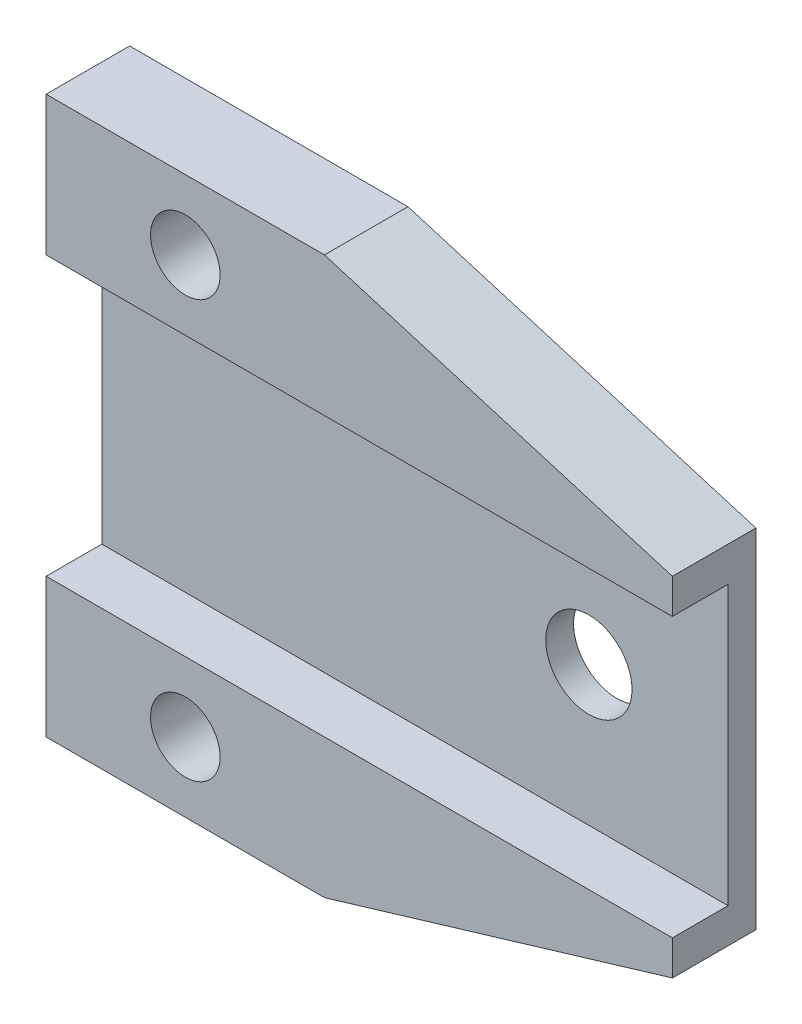
ISO-10303-21;
HEADER;
FILE_DESCRIPTION(('STEP AP214'),'2;1');
FILE_NAME('part.step','',(''),(''),'','','');
FILE_SCHEMA(('AUTOMOTIVE_DESIGN { 1 0 10303 214 1 1 1 1 }'));
ENDSEC;
DATA;
#1=APPLICATION_CONTEXT('core data for automotive mechanical design processes');
#2=APPLICATION_PROTOCOL_DEFINITION('international standard','automotive_design',2000,#1);
#3=PRODUCT_CONTEXT('',#1,'mechanical');
#4=PRODUCT('Part','Part','',(#3));
#5=PRODUCT_RELATED_PRODUCT_CATEGORY('part','',(#4));
#6=PRODUCT_DEFINITION_FORMATION('','',#4);
#7=PRODUCT_DEFINITION_CONTEXT('part definition',#1,'design');
#8=PRODUCT_DEFINITION('design','',#6,#7);
#9=PRODUCT_DEFINITION_SHAPE('','',#8);
#10=(LENGTH_UNIT() NAMED_UNIT(*) SI_UNIT(.MILLI.,.METRE.));
#11=(NAMED_UNIT(*) PLANE_ANGLE_UNIT() SI_UNIT($,.RADIAN.));
#12=(NAMED_UNIT(*) SI_UNIT($,.STERADIAN.) SOLID_ANGLE_UNIT());
#13=UNCERTAINTY_MEASURE_WITH_UNIT(LENGTH_MEASURE(1.E-05),#10,'distance_accuracy_value','');
#14=(GEOMETRIC_REPRESENTATION_CONTEXT(3) GLOBAL_UNCERTAINTY_ASSIGNED_CONTEXT((#13)) GLOBAL_UNIT_ASSIGNED_CONTEXT((#10,
#11,#12)) REPRESENTATION_CONTEXT('',''));
#15=CARTESIAN_POINT('',(0.,0.,0.));
#16=DIRECTION('',(0.,0.,1.));
#17=DIRECTION('',(1.,0.,0.));
#18=AXIS2_PLACEMENT_3D('',#15,#16,#17);
#19=CARTESIAN_POINT('',(0.,0.,6.));
#20=DIRECTION('',(0.,0.,1.));
#21=DIRECTION('',(1.,0.,0.));
#22=AXIS2_PLACEMENT_3D('',#19,#20,#21);
#23=PLANE('',#22);
#24=DIRECTION('',(1.,0.,0.));
#25=VECTOR('',#24,1.);
#26=CARTESIAN_POINT('',(-10.001,10.,6.));
#27=LINE('',#26,#25);
#28=CARTESIAN_POINT('',(-10.,10.,6.));
#29=VERTEX_POINT('',#28);
#30=CARTESIAN_POINT('',(35.,10.,6.));
#31=VERTEX_POINT('',#30);
#32=EDGE_CURVE('E117',#29,#31,#27,.T.);
#33=ORIENTED_EDGE('',*,*,#32,.T.);
#34=DIRECTION('',(0.,1.,0.));
#35=VECTOR('',#34,1.);
#36=CARTESIAN_POINT('',(35.,12.5,6.));
#37=LINE('',#36,#35);
#38=CARTESIAN_POINT('',(35.,12.5,6.));
#39=VERTEX_POINT('',#38);
#40=EDGE_CURVE('E109',#31,#39,#37,.T.);
#41=ORIENTED_EDGE('',*,*,#40,.T.);
#42=DIRECTION('',(-0.957826285221151,0.287347885566345,0.));
#43=VECTOR('',#42,1.);
#44=CARTESIAN_POINT('',(10.,20.,6.));
#45=LINE('',#44,#43);
#46=CARTESIAN_POINT('',(10.,20.,6.));
#47=VERTEX_POINT('',#46);
#48=EDGE_CURVE('E113',#39,#47,#45,.T.);
#49=ORIENTED_EDGE('',*,*,#48,.T.);
#50=DIRECTION('',(-1.,0.,0.));
#51=VECTOR('',#50,1.);
#52=CARTESIAN_POINT('',(-10.,20.,6.));
#53=LINE('',#52,#51);
#54=CARTESIAN_POINT('',(-10.,20.,6.));
#55=VERTEX_POINT('',#54);
#56=EDGE_CURVE('E63',#47,#55,#53,.T.);
#57=ORIENTED_EDGE('',*,*,#56,.T.);
#58=DIRECTION('',(0.,-1.,0.));
#59=VECTOR('',#58,1.);
#60=CARTESIAN_POINT('',(-10.,20.,6.));
#61=LINE('',#60,#59);
#62=EDGE_CURVE('E171',#55,#29,#61,.T.);
#63=ORIENTED_EDGE('',*,*,#62,.T.);
#64=EDGE_LOOP('',(#33,#41,#49,#57,#63));
#65=FACE_BOUND('',#64,.T.);
#66=CARTESIAN_POINT('',(0.,15.,6.));
#67=DIRECTION('',(0.,0.,1.));
#68=DIRECTION('',(1.,0.,0.));
#69=AXIS2_PLACEMENT_3D('',#66,#67,#68);
#70=CIRCLE('',#69,2.5);
#71=CARTESIAN_POINT('',(2.5,15.,6.));
#72=VERTEX_POINT('',#71);
#73=EDGE_CURVE('E210',#72,#72,#70,.T.);
#74=ORIENTED_EDGE('',*,*,#73,.F.);
#75=EDGE_LOOP('',(#74));
#76=FACE_BOUND('',#75,.T.);
#77=ADVANCED_FACE('F39',(#65,#76),#23,.T.);
#78=DIRECTION('',(1.,0.,0.));
#79=VECTOR('',#78,1.);
#80=CARTESIAN_POINT('',(-10.001,-10.,6.));
#81=LINE('',#80,#79);
#82=CARTESIAN_POINT('',(-10.,-10.,6.));
#83=VERTEX_POINT('',#82);
#84=CARTESIAN_POINT('',(35.,-10.,6.));
#85=VERTEX_POINT('',#84);
#86=EDGE_CURVE('E54',#83,#85,#81,.T.);
#87=ORIENTED_EDGE('',*,*,#86,.F.);
#88=CARTESIAN_POINT('',(-10.,-20.,6.));
#89=VERTEX_POINT('',#88);
#90=EDGE_CURVE('E98',#83,#89,#61,.T.);
#91=ORIENTED_EDGE('',*,*,#90,.T.);
#92=DIRECTION('',(1.,0.,0.));
#93=VECTOR('',#92,1.);
#94=CARTESIAN_POINT('',(-10.,-20.,6.));
#95=LINE('',#94,#93);
#96=CARTESIAN_POINT('',(10.,-20.,6.));
#97=VERTEX_POINT('',#96);
#98=EDGE_CURVE('E175',#89,#97,#95,.T.);
#99=ORIENTED_EDGE('',*,*,#98,.T.);
#100=DIRECTION('',(0.957826285221151,0.287347885566345,0.));
#101=VECTOR('',#100,1.);
#102=CARTESIAN_POINT('',(10.,-20.,6.));
#103=LINE('',#102,#101);
#104=CARTESIAN_POINT('',(35.,-12.5,6.));
#105=VERTEX_POINT('',#104);
#106=EDGE_CURVE('E121',#97,#105,#103,.T.);
#107=ORIENTED_EDGE('',*,*,#106,.T.);
#108=EDGE_CURVE('E120',#105,#85,#37,.T.);
#109=ORIENTED_EDGE('',*,*,#108,.T.);
#110=EDGE_LOOP('',(#87,#91,#99,#107,#109));
#111=FACE_BOUND('',#110,.T.);
#112=CARTESIAN_POINT('',(0.,-15.,6.));
#113=DIRECTION('',(0.,0.,1.));
#114=DIRECTION('',(1.,0.,0.));
#115=AXIS2_PLACEMENT_3D('',#112,#113,#114);
#116=CIRCLE('',#115,2.5);
#117=CARTESIAN_POINT('',(2.5,-15.,6.));
#118=VERTEX_POINT('',#117);
#119=EDGE_CURVE('E145',#118,#118,#116,.T.);
#120=ORIENTED_EDGE('',*,*,#119,.F.);
#121=EDGE_LOOP('',(#120));
#122=FACE_BOUND('',#121,.T.);
#123=ADVANCED_FACE('F181',(#111,#122),#23,.T.);
#124=CARTESIAN_POINT('',(0.,0.,0.));
#125=DIRECTION('',(0.,0.,1.));
#126=DIRECTION('',(1.,0.,0.));
#127=AXIS2_PLACEMENT_3D('',#124,#125,#126);
#128=PLANE('',#127);
#129=CARTESIAN_POINT('',(25.,0.,0.));
#130=DIRECTION('',(0.,0.,1.));
#131=DIRECTION('',(1.,0.,0.));
#132=AXIS2_PLACEMENT_3D('',#129,#130,#131);
#133=CIRCLE('',#132,3.1);
#134=CARTESIAN_POINT('',(28.1,0.,0.));
#135=VERTEX_POINT('',#134);
#136=EDGE_CURVE('E367',#135,#135,#133,.F.);
#137=ORIENTED_EDGE('',*,*,#136,.F.);
#138=EDGE_LOOP('',(#137));
#139=FACE_BOUND('',#138,.T.);
#140=DIRECTION('',(0.,-1.,0.));
#141=VECTOR('',#140,1.);
#142=CARTESIAN_POINT('',(-10.,20.,0.));
#143=LINE('',#142,#141);
#144=CARTESIAN_POINT('',(-10.,20.,0.));
#145=VERTEX_POINT('',#144);
#146=CARTESIAN_POINT('',(-10.,-20.,0.));
#147=VERTEX_POINT('',#146);
#148=EDGE_CURVE('E141',#145,#147,#143,.T.);
#149=ORIENTED_EDGE('',*,*,#148,.F.);
#150=DIRECTION('',(-1.,0.,0.));
#151=VECTOR('',#150,1.);
#152=CARTESIAN_POINT('',(-10.,20.,0.));
#153=LINE('',#152,#151);
#154=CARTESIAN_POINT('',(10.,20.,0.));
#155=VERTEX_POINT('',#154);
#156=EDGE_CURVE('E90',#155,#145,#153,.T.);
#157=ORIENTED_EDGE('',*,*,#156,.F.);
#158=DIRECTION('',(-0.957826285221151,0.287347885566345,0.));
#159=VECTOR('',#158,1.);
#160=CARTESIAN_POINT('',(10.,20.,0.));
#161=LINE('',#160,#159);
#162=CARTESIAN_POINT('',(35.,12.5,0.));
#163=VERTEX_POINT('',#162);
#164=EDGE_CURVE('E150',#163,#155,#161,.T.);
#165=ORIENTED_EDGE('',*,*,#164,.F.);
#166=DIRECTION('',(0.,1.,0.));
#167=VECTOR('',#166,1.);
#168=CARTESIAN_POINT('',(35.,12.5,0.));
#169=LINE('',#168,#167);
#170=CARTESIAN_POINT('',(35.,-12.5,0.));
#171=VERTEX_POINT('',#170);
#172=EDGE_CURVE('E128',#171,#163,#169,.T.);
#173=ORIENTED_EDGE('',*,*,#172,.F.);
#174=DIRECTION('',(0.957826285221151,0.287347885566345,0.));
#175=VECTOR('',#174,1.);
#176=CARTESIAN_POINT('',(10.,-20.,0.));
#177=LINE('',#176,#175);
#178=CARTESIAN_POINT('',(10.,-20.,0.));
#179=VERTEX_POINT('',#178);
#180=EDGE_CURVE('E147',#179,#171,#177,.T.);
#181=ORIENTED_EDGE('',*,*,#180,.F.);
#182=DIRECTION('',(1.,0.,0.));
#183=VECTOR('',#182,1.);
#184=CARTESIAN_POINT('',(-10.,-20.,0.));
#185=LINE('',#184,#183);
#186=EDGE_CURVE('E144',#147,#179,#185,.T.);
#187=ORIENTED_EDGE('',*,*,#186,.F.);
#188=EDGE_LOOP('',(#149,#157,#165,#173,#181,#187));
#189=FACE_BOUND('',#188,.T.);
#190=CARTESIAN_POINT('',(0.,-15.,0.));
#191=DIRECTION('',(0.,0.,1.));
#192=DIRECTION('',(1.,0.,0.));
#193=AXIS2_PLACEMENT_3D('',#190,#191,#192);
#194=CIRCLE('',#193,2.5);
#195=CARTESIAN_POINT('',(2.5,-15.,0.));
#196=VERTEX_POINT('',#195);
#197=EDGE_CURVE('E179',#196,#196,#194,.T.);
#198=ORIENTED_EDGE('',*,*,#197,.T.);
#199=EDGE_LOOP('',(#198));
#200=FACE_BOUND('',#199,.T.);
#201=CARTESIAN_POINT('',(0.,15.,0.));
#202=DIRECTION('',(0.,0.,1.));
#203=DIRECTION('',(1.,0.,0.));
#204=AXIS2_PLACEMENT_3D('',#201,#202,#203);
#205=CIRCLE('',#204,2.5);
#206=CARTESIAN_POINT('',(2.5,15.,0.));
#207=VERTEX_POINT('',#206);
#208=EDGE_CURVE('E209',#207,#207,#205,.T.);
#209=ORIENTED_EDGE('',*,*,#208,.T.);
#210=EDGE_LOOP('',(#209));
#211=FACE_BOUND('',#210,.T.);
#212=ADVANCED_FACE('F165',(#139,#189,#200,#211),#128,.F.);
#213=CARTESIAN_POINT('',(-10.,20.,6.));
#214=DIRECTION('',(1.,0.,0.));
#215=DIRECTION('',(0.,1.,0.));
#216=AXIS2_PLACEMENT_3D('',#213,#214,#215);
#217=PLANE('',#216);
#218=DIRECTION('',(0.,-1.,0.));
#219=VECTOR('',#218,1.);
#220=CARTESIAN_POINT('',(-10.,9.99999999999999,2.));
#221=LINE('',#220,#219);
#222=CARTESIAN_POINT('',(-10.,9.99999999999999,2.));
#223=VERTEX_POINT('',#222);
#224=CARTESIAN_POINT('',(-10.,-10.,2.));
#225=VERTEX_POINT('',#224);
#226=EDGE_CURVE('E193',#223,#225,#221,.T.);
#227=ORIENTED_EDGE('',*,*,#226,.F.);
#228=DIRECTION('',(0.,0.,-1.));
#229=VECTOR('',#228,1.);
#230=CARTESIAN_POINT('',(-10.,10.,6.));
#231=LINE('',#230,#229);
#232=EDGE_CURVE('E174',#29,#223,#231,.T.);
#233=ORIENTED_EDGE('',*,*,#232,.F.);
#234=ORIENTED_EDGE('',*,*,#62,.F.);
#235=DIRECTION('',(0.,0.,-1.));
#236=VECTOR('',#235,1.);
#237=CARTESIAN_POINT('',(-10.,20.,6.));
#238=LINE('',#237,#236);
#239=EDGE_CURVE('E136',#55,#145,#238,.T.);
#240=ORIENTED_EDGE('',*,*,#239,.T.);
#241=ORIENTED_EDGE('',*,*,#148,.T.);
#242=DIRECTION('',(0.,0.,-1.));
#243=VECTOR('',#242,1.);
#244=CARTESIAN_POINT('',(-10.,-20.,6.));
#245=LINE('',#244,#243);
#246=EDGE_CURVE('E11',#89,#147,#245,.T.);
#247=ORIENTED_EDGE('',*,*,#246,.F.);
#248=ORIENTED_EDGE('',*,*,#90,.F.);
#249=DIRECTION('',(0.,0.,1.));
#250=VECTOR('',#249,1.);
#251=CARTESIAN_POINT('',(-10.,-10.,6.));
#252=LINE('',#251,#250);
#253=EDGE_CURVE('E200',#225,#83,#252,.T.);
#254=ORIENTED_EDGE('',*,*,#253,.F.);
#255=EDGE_LOOP('',(#227,#233,#234,#240,#241,#247,#248,#254));
#256=FACE_BOUND('',#255,.T.);
#257=ADVANCED_FACE('F41',(#256),#217,.F.);
#258=CARTESIAN_POINT('',(-10.,-20.,6.));
#259=DIRECTION('',(0.,1.,0.));
#260=DIRECTION('',(0.,0.,1.));
#261=AXIS2_PLACEMENT_3D('',#258,#259,#260);
#262=PLANE('',#261);
#263=ORIENTED_EDGE('',*,*,#186,.T.);
#264=DIRECTION('',(0.,0.,-1.));
#265=VECTOR('',#264,1.);
#266=CARTESIAN_POINT('',(10.,-20.,6.));
#267=LINE('',#266,#265);
#268=EDGE_CURVE('E47',#97,#179,#267,.T.);
#269=ORIENTED_EDGE('',*,*,#268,.F.);
#270=ORIENTED_EDGE('',*,*,#98,.F.);
#271=ORIENTED_EDGE('',*,*,#246,.T.);
#272=EDGE_LOOP('',(#263,#269,#270,#271));
#273=FACE_BOUND('',#272,.T.);
#274=ADVANCED_FACE('F247',(#273),#262,.F.);
#275=CARTESIAN_POINT('',(10.,-20.,6.));
#276=DIRECTION('',(-0.287347885566345,0.957826285221151,0.));
#277=DIRECTION('',(-0.957826285221152,-0.287347885566346,0.));
#278=AXIS2_PLACEMENT_3D('',#275,#276,#277);
#279=PLANE('',#278);
#280=ORIENTED_EDGE('',*,*,#180,.T.);
#281=DIRECTION('',(0.,0.,-1.));
#282=VECTOR('',#281,1.);
#283=CARTESIAN_POINT('',(35.,-12.5,6.));
#284=LINE('',#283,#282);
#285=EDGE_CURVE('E131',#105,#171,#284,.T.);
#286=ORIENTED_EDGE('',*,*,#285,.F.);
#287=ORIENTED_EDGE('',*,*,#106,.F.);
#288=ORIENTED_EDGE('',*,*,#268,.T.);
#289=EDGE_LOOP('',(#280,#286,#287,#288));
#290=FACE_BOUND('',#289,.T.);
#291=ADVANCED_FACE('F160',(#290),#279,.F.);
#292=CARTESIAN_POINT('',(35.,12.5,6.));
#293=DIRECTION('',(-1.,0.,0.));
#294=DIRECTION('',(0.,0.,1.));
#295=AXIS2_PLACEMENT_3D('',#292,#293,#294);
#296=PLANE('',#295);
#297=ORIENTED_EDGE('',*,*,#40,.F.);
#298=DIRECTION('',(0.,0.,1.));
#299=VECTOR('',#298,1.);
#300=CARTESIAN_POINT('',(35.,10.,6.));
#301=LINE('',#300,#299);
#302=CARTESIAN_POINT('',(35.,9.99999999999999,2.));
#303=VERTEX_POINT('',#302);
#304=EDGE_CURVE('E191',#303,#31,#301,.T.);
#305=ORIENTED_EDGE('',*,*,#304,.F.);
#306=DIRECTION('',(0.,1.,0.));
#307=VECTOR('',#306,1.);
#308=CARTESIAN_POINT('',(35.,9.99999999999999,2.));
#309=LINE('',#308,#307);
#310=CARTESIAN_POINT('',(35.,-10.,2.));
#311=VERTEX_POINT('',#310);
#312=EDGE_CURVE('E188',#311,#303,#309,.T.);
#313=ORIENTED_EDGE('',*,*,#312,.F.);
#314=DIRECTION('',(0.,0.,-1.));
#315=VECTOR('',#314,1.);
#316=CARTESIAN_POINT('',(35.,-10.,6.));
#317=LINE('',#316,#315);
#318=EDGE_CURVE('E185',#85,#311,#317,.T.);
#319=ORIENTED_EDGE('',*,*,#318,.F.);
#320=ORIENTED_EDGE('',*,*,#108,.F.);
#321=ORIENTED_EDGE('',*,*,#285,.T.);
#322=ORIENTED_EDGE('',*,*,#172,.T.);
#323=DIRECTION('',(0.,0.,-1.));
#324=VECTOR('',#323,1.);
#325=CARTESIAN_POINT('',(35.,12.5,6.));
#326=LINE('',#325,#324);
#327=EDGE_CURVE('E124',#39,#163,#326,.T.);
#328=ORIENTED_EDGE('',*,*,#327,.F.);
#329=EDGE_LOOP('',(#297,#305,#313,#319,#320,#321,#322,#328));
#330=FACE_BOUND('',#329,.T.);
#331=ADVANCED_FACE('F125',(#330),#296,.F.);
#332=CARTESIAN_POINT('',(10.,20.,6.));
#333=DIRECTION('',(-0.287347885566345,-0.957826285221151,0.));
#334=DIRECTION('',(0.957826285221152,-0.287347885566346,0.));
#335=AXIS2_PLACEMENT_3D('',#332,#333,#334);
#336=PLANE('',#335);
#337=ORIENTED_EDGE('',*,*,#164,.T.);
#338=DIRECTION('',(0.,0.,-1.));
#339=VECTOR('',#338,1.);
#340=CARTESIAN_POINT('',(10.,20.,6.));
#341=LINE('',#340,#339);
#342=EDGE_CURVE('E132',#47,#155,#341,.T.);
#343=ORIENTED_EDGE('',*,*,#342,.F.);
#344=ORIENTED_EDGE('',*,*,#48,.F.);
#345=ORIENTED_EDGE('',*,*,#327,.T.);
#346=EDGE_LOOP('',(#337,#343,#344,#345));
#347=FACE_BOUND('',#346,.T.);
#348=ADVANCED_FACE('F134',(#347),#336,.F.);
#349=CARTESIAN_POINT('',(-10.,20.,6.));
#350=DIRECTION('',(0.,-1.,0.));
#351=DIRECTION('',(0.,0.,-1.));
#352=AXIS2_PLACEMENT_3D('',#349,#350,#351);
#353=PLANE('',#352);
#354=ORIENTED_EDGE('',*,*,#156,.T.);
#355=ORIENTED_EDGE('',*,*,#239,.F.);
#356=ORIENTED_EDGE('',*,*,#56,.F.);
#357=ORIENTED_EDGE('',*,*,#342,.T.);
#358=EDGE_LOOP('',(#354,#355,#356,#357));
#359=FACE_BOUND('',#358,.T.);
#360=ADVANCED_FACE('F167',(#359),#353,.F.);
#361=CARTESIAN_POINT('',(0.,-15.,6.));
#362=DIRECTION('',(0.,0.,-1.));
#363=DIRECTION('',(-1.,0.,0.));
#364=AXIS2_PLACEMENT_3D('',#361,#362,#363);
#365=CYLINDRICAL_SURFACE('',#364,2.5);
#366=ORIENTED_EDGE('',*,*,#119,.T.);
#367=EDGE_LOOP('',(#366));
#368=FACE_BOUND('',#367,.T.);
#369=ORIENTED_EDGE('',*,*,#197,.F.);
#370=EDGE_LOOP('',(#369));
#371=FACE_BOUND('',#370,.T.);
#372=ADVANCED_FACE('F221',(#368,#371),#365,.F.);
#373=CARTESIAN_POINT('',(0.,15.,6.));
#374=DIRECTION('',(0.,0.,-1.));
#375=DIRECTION('',(-1.,0.,0.));
#376=AXIS2_PLACEMENT_3D('',#373,#374,#375);
#377=CYLINDRICAL_SURFACE('',#376,2.5);
#378=ORIENTED_EDGE('',*,*,#73,.T.);
#379=EDGE_LOOP('',(#378));
#380=FACE_BOUND('',#379,.T.);
#381=ORIENTED_EDGE('',*,*,#208,.F.);
#382=EDGE_LOOP('',(#381));
#383=FACE_BOUND('',#382,.T.);
#384=ADVANCED_FACE('F223',(#380,#383),#377,.F.);
#385=CARTESIAN_POINT('',(-10.001,10.,6.));
#386=DIRECTION('',(0.,1.,0.));
#387=DIRECTION('',(0.,0.,1.));
#388=AXIS2_PLACEMENT_3D('',#385,#386,#387);
#389=PLANE('',#388);
#390=ORIENTED_EDGE('',*,*,#232,.T.);
#391=DIRECTION('',(1.,0.,0.));
#392=VECTOR('',#391,1.);
#393=CARTESIAN_POINT('',(-10.001,9.99999999999999,2.));
#394=LINE('',#393,#392);
#395=EDGE_CURVE('E201',#223,#303,#394,.T.);
#396=ORIENTED_EDGE('',*,*,#395,.T.);
#397=ORIENTED_EDGE('',*,*,#304,.T.);
#398=ORIENTED_EDGE('',*,*,#32,.F.);
#399=EDGE_LOOP('',(#390,#396,#397,#398));
#400=FACE_BOUND('',#399,.T.);
#401=ADVANCED_FACE('F229',(#400),#389,.F.);
#402=CARTESIAN_POINT('',(-10.001,9.99999999999999,2.));
#403=DIRECTION('',(0.,0.,-1.));
#404=DIRECTION('',(-1.,0.,0.));
#405=AXIS2_PLACEMENT_3D('',#402,#403,#404);
#406=PLANE('',#405);
#407=CARTESIAN_POINT('',(25.,0.,2.));
#408=DIRECTION('',(0.,0.,1.));
#409=DIRECTION('',(1.,0.,0.));
#410=AXIS2_PLACEMENT_3D('',#407,#408,#409);
#411=CIRCLE('',#410,3.1);
#412=CARTESIAN_POINT('',(28.1,0.,2.));
#413=VERTEX_POINT('',#412);
#414=EDGE_CURVE('E366',#413,#413,#411,.T.);
#415=ORIENTED_EDGE('',*,*,#414,.F.);
#416=EDGE_LOOP('',(#415));
#417=FACE_BOUND('',#416,.T.);
#418=ORIENTED_EDGE('',*,*,#226,.T.);
#419=DIRECTION('',(1.,0.,0.));
#420=VECTOR('',#419,1.);
#421=CARTESIAN_POINT('',(-10.001,-10.,2.));
#422=LINE('',#421,#420);
#423=EDGE_CURVE('E204',#225,#311,#422,.T.);
#424=ORIENTED_EDGE('',*,*,#423,.T.);
#425=ORIENTED_EDGE('',*,*,#312,.T.);
#426=ORIENTED_EDGE('',*,*,#395,.F.);
#427=EDGE_LOOP('',(#418,#424,#425,#426));
#428=FACE_BOUND('',#427,.T.);
#429=ADVANCED_FACE('F267',(#417,#428),#406,.F.);
#430=CARTESIAN_POINT('',(-10.001,-10.,6.));
#431=DIRECTION('',(0.,-1.,0.));
#432=DIRECTION('',(0.,0.,-1.));
#433=AXIS2_PLACEMENT_3D('',#430,#431,#432);
#434=PLANE('',#433);
#435=ORIENTED_EDGE('',*,*,#253,.T.);
#436=ORIENTED_EDGE('',*,*,#86,.T.);
#437=ORIENTED_EDGE('',*,*,#318,.T.);
#438=ORIENTED_EDGE('',*,*,#423,.F.);
#439=EDGE_LOOP('',(#435,#436,#437,#438));
#440=FACE_BOUND('',#439,.T.);
#441=ADVANCED_FACE('F268',(#440),#434,.F.);
#442=CARTESIAN_POINT('',(25.,0.,-0.00100000000000013));
#443=DIRECTION('',(0.,0.,1.));
#444=DIRECTION('',(1.,0.,0.));
#445=AXIS2_PLACEMENT_3D('',#442,#443,#444);
#446=CYLINDRICAL_SURFACE('',#445,3.1);
#447=ORIENTED_EDGE('',*,*,#414,.T.);
#448=EDGE_LOOP('',(#447));
#449=FACE_BOUND('',#448,.T.);
#450=ORIENTED_EDGE('',*,*,#136,.T.);
#451=EDGE_LOOP('',(#450));
#452=FACE_BOUND('',#451,.T.);
#453=ADVANCED_FACE('F270',(#449,#452),#446,.F.);
#454=CLOSED_SHELL('',(#77,#123,#212,#257,#274,#291,#331,#348,#360,#372,#384,#401,#429,#441,#453));
#455=MANIFOLD_SOLID_BREP('B2',#454);
#456=ADVANCED_BREP_SHAPE_REPRESENTATION('',(#18,#455),#14);
#457=SHAPE_DEFINITION_REPRESENTATION(#9,#456);
ENDSEC;
END-ISO-10303-21;
